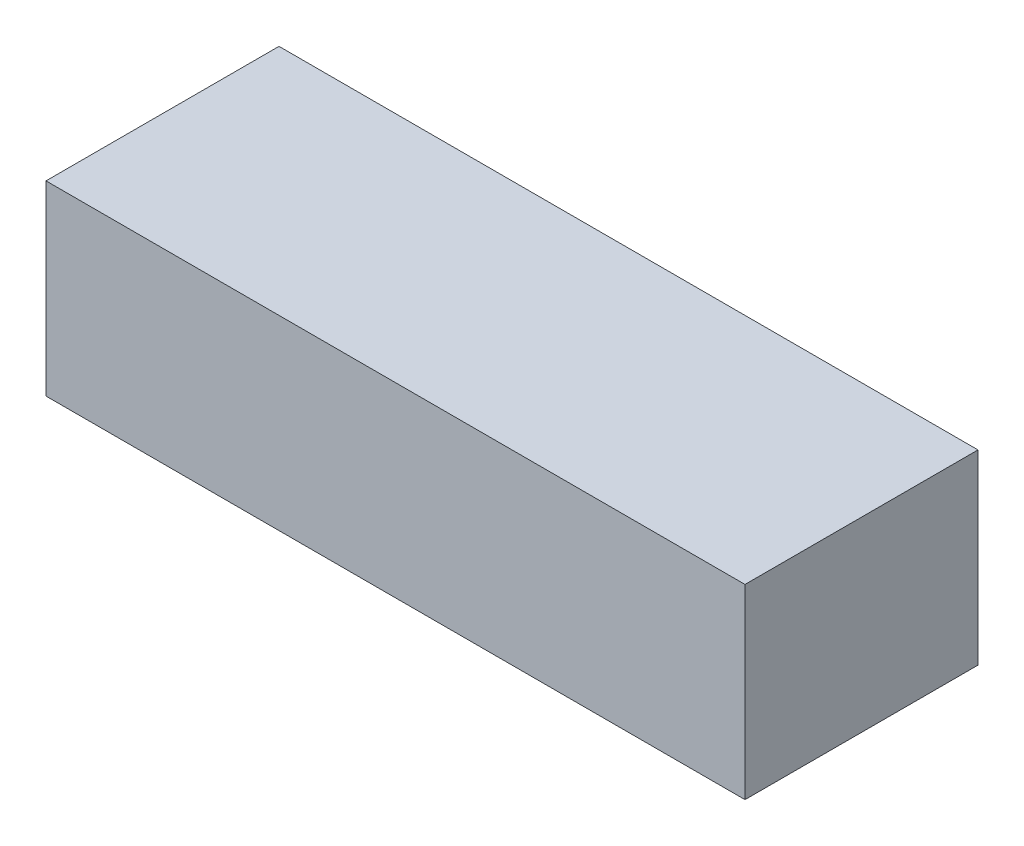
ISO-10303-21;
HEADER;
FILE_DESCRIPTION(('STEP AP214'),'2;1');
FILE_NAME('part.step','',(''),(''),'','','');
FILE_SCHEMA(('AUTOMOTIVE_DESIGN { 1 0 10303 214 1 1 1 1 }'));
ENDSEC;
DATA;
#1=APPLICATION_CONTEXT('core data for automotive mechanical design processes');
#2=APPLICATION_PROTOCOL_DEFINITION('international standard','automotive_design',2000,#1);
#3=PRODUCT_CONTEXT('',#1,'mechanical');
#4=PRODUCT('Part','Part','',(#3));
#5=PRODUCT_RELATED_PRODUCT_CATEGORY('part','',(#4));
#6=PRODUCT_DEFINITION_FORMATION('','',#4);
#7=PRODUCT_DEFINITION_CONTEXT('part definition',#1,'design');
#8=PRODUCT_DEFINITION('design','',#6,#7);
#9=PRODUCT_DEFINITION_SHAPE('','',#8);
#10=(LENGTH_UNIT() NAMED_UNIT(*) SI_UNIT(.MILLI.,.METRE.));
#11=(NAMED_UNIT(*) PLANE_ANGLE_UNIT() SI_UNIT($,.RADIAN.));
#12=(NAMED_UNIT(*) SI_UNIT($,.STERADIAN.) SOLID_ANGLE_UNIT());
#13=UNCERTAINTY_MEASURE_WITH_UNIT(LENGTH_MEASURE(1.E-05),#10,'distance_accuracy_value','');
#14=(GEOMETRIC_REPRESENTATION_CONTEXT(3) GLOBAL_UNCERTAINTY_ASSIGNED_CONTEXT((#13)) GLOBAL_UNIT_ASSIGNED_CONTEXT((#10,
#11,#12)) REPRESENTATION_CONTEXT('',''));
#15=CARTESIAN_POINT('',(0.,0.,0.));
#16=DIRECTION('',(0.,0.,1.));
#17=DIRECTION('',(1.,0.,0.));
#18=AXIS2_PLACEMENT_3D('',#15,#16,#17);
#19=CARTESIAN_POINT('',(1.51,-0.41,0.));
#20=DIRECTION('',(0.,0.,-1.));
#21=DIRECTION('',(-1.,0.,0.));
#22=AXIS2_PLACEMENT_3D('',#19,#20,#21);
#23=PLANE('',#22);
#24=DIRECTION('',(0.,-1.,0.));
#25=VECTOR('',#24,1.);
#26=CARTESIAN_POINT('',(-1.5,0.,0.));
#27=LINE('',#26,#25);
#28=CARTESIAN_POINT('',(-1.5,0.4,0.));
#29=VERTEX_POINT('',#28);
#30=CARTESIAN_POINT('',(-1.5,-0.4,0.));
#31=VERTEX_POINT('',#30);
#32=EDGE_CURVE('E68',#29,#31,#27,.T.);
#33=ORIENTED_EDGE('',*,*,#32,.F.);
#34=DIRECTION('',(-1.,0.,0.));
#35=VECTOR('',#34,1.);
#36=CARTESIAN_POINT('',(0.,0.4,0.));
#37=LINE('',#36,#35);
#38=CARTESIAN_POINT('',(1.5,0.4,0.));
#39=VERTEX_POINT('',#38);
#40=EDGE_CURVE('E55',#39,#29,#37,.T.);
#41=ORIENTED_EDGE('',*,*,#40,.F.);
#42=DIRECTION('',(0.,1.,0.));
#43=VECTOR('',#42,1.);
#44=CARTESIAN_POINT('',(1.5,0.,0.));
#45=LINE('',#44,#43);
#46=CARTESIAN_POINT('',(1.5,-0.4,0.));
#47=VERTEX_POINT('',#46);
#48=EDGE_CURVE('E20',#47,#39,#45,.T.);
#49=ORIENTED_EDGE('',*,*,#48,.F.);
#50=DIRECTION('',(1.,0.,0.));
#51=VECTOR('',#50,1.);
#52=CARTESIAN_POINT('',(0.,-0.4,0.));
#53=LINE('',#52,#51);
#54=EDGE_CURVE('E80',#31,#47,#53,.T.);
#55=ORIENTED_EDGE('',*,*,#54,.F.);
#56=EDGE_LOOP('',(#33,#41,#49,#55));
#57=FACE_BOUND('',#56,.T.);
#58=ADVANCED_FACE('F16',(#57),#23,.T.);
#59=CARTESIAN_POINT('',(1.5,-0.41,1.01));
#60=DIRECTION('',(1.,0.,0.));
#61=DIRECTION('',(0.,0.,-1.));
#62=AXIS2_PLACEMENT_3D('',#59,#60,#61);
#63=PLANE('',#62);
#64=DIRECTION('',(0.,0.,-1.));
#65=VECTOR('',#64,1.);
#66=CARTESIAN_POINT('',(1.5,0.4,0.5));
#67=LINE('',#66,#65);
#68=CARTESIAN_POINT('',(1.5,0.4,1.));
#69=VERTEX_POINT('',#68);
#70=EDGE_CURVE('E61',#69,#39,#67,.T.);
#71=ORIENTED_EDGE('',*,*,#70,.F.);
#72=DIRECTION('',(0.,1.,0.));
#73=VECTOR('',#72,1.);
#74=CARTESIAN_POINT('',(1.5,0.,1.));
#75=LINE('',#74,#73);
#76=CARTESIAN_POINT('',(1.5,-0.4,1.));
#77=VERTEX_POINT('',#76);
#78=EDGE_CURVE('E83',#77,#69,#75,.T.);
#79=ORIENTED_EDGE('',*,*,#78,.F.);
#80=DIRECTION('',(0.,0.,1.));
#81=VECTOR('',#80,1.);
#82=CARTESIAN_POINT('',(1.5,-0.4,0.5));
#83=LINE('',#82,#81);
#84=EDGE_CURVE('E64',#47,#77,#83,.T.);
#85=ORIENTED_EDGE('',*,*,#84,.F.);
#86=ORIENTED_EDGE('',*,*,#48,.T.);
#87=EDGE_LOOP('',(#71,#79,#85,#86));
#88=FACE_BOUND('',#87,.T.);
#89=ADVANCED_FACE('F60',(#88),#63,.T.);
#90=CARTESIAN_POINT('',(-1.51,0.4,-0.01));
#91=DIRECTION('',(0.,1.,0.));
#92=DIRECTION('',(0.,0.,1.));
#93=AXIS2_PLACEMENT_3D('',#90,#91,#92);
#94=PLANE('',#93);
#95=DIRECTION('',(0.,0.,-1.));
#96=VECTOR('',#95,1.);
#97=CARTESIAN_POINT('',(-1.5,0.4,0.5));
#98=LINE('',#97,#96);
#99=CARTESIAN_POINT('',(-1.5,0.4,1.));
#100=VERTEX_POINT('',#99);
#101=EDGE_CURVE('E70',#100,#29,#98,.T.);
#102=ORIENTED_EDGE('',*,*,#101,.F.);
#103=DIRECTION('',(-1.,0.,0.));
#104=VECTOR('',#103,1.);
#105=CARTESIAN_POINT('',(0.,0.4,1.));
#106=LINE('',#105,#104);
#107=EDGE_CURVE('E74',#69,#100,#106,.T.);
#108=ORIENTED_EDGE('',*,*,#107,.F.);
#109=ORIENTED_EDGE('',*,*,#70,.T.);
#110=ORIENTED_EDGE('',*,*,#40,.T.);
#111=EDGE_LOOP('',(#102,#108,#109,#110));
#112=FACE_BOUND('',#111,.T.);
#113=ADVANCED_FACE('F72',(#112),#94,.T.);
#114=CARTESIAN_POINT('',(-1.5,-0.41,-0.01));
#115=DIRECTION('',(-1.,0.,0.));
#116=DIRECTION('',(0.,0.,1.));
#117=AXIS2_PLACEMENT_3D('',#114,#115,#116);
#118=PLANE('',#117);
#119=DIRECTION('',(0.,0.,-1.));
#120=VECTOR('',#119,1.);
#121=CARTESIAN_POINT('',(-1.5,-0.4,0.5));
#122=LINE('',#121,#120);
#123=CARTESIAN_POINT('',(-1.5,-0.4,1.));
#124=VERTEX_POINT('',#123);
#125=EDGE_CURVE('E35',#124,#31,#122,.T.);
#126=ORIENTED_EDGE('',*,*,#125,.F.);
#127=DIRECTION('',(0.,-1.,0.));
#128=VECTOR('',#127,1.);
#129=CARTESIAN_POINT('',(-1.5,0.,1.));
#130=LINE('',#129,#128);
#131=EDGE_CURVE('E26',#100,#124,#130,.T.);
#132=ORIENTED_EDGE('',*,*,#131,.F.);
#133=ORIENTED_EDGE('',*,*,#101,.T.);
#134=ORIENTED_EDGE('',*,*,#32,.T.);
#135=EDGE_LOOP('',(#126,#132,#133,#134));
#136=FACE_BOUND('',#135,.T.);
#137=ADVANCED_FACE('F88',(#136),#118,.T.);
#138=CARTESIAN_POINT('',(-1.51,-0.4,1.01));
#139=DIRECTION('',(0.,-1.,0.));
#140=DIRECTION('',(0.,0.,-1.));
#141=AXIS2_PLACEMENT_3D('',#138,#139,#140);
#142=PLANE('',#141);
#143=ORIENTED_EDGE('',*,*,#84,.T.);
#144=DIRECTION('',(1.,0.,0.));
#145=VECTOR('',#144,1.);
#146=CARTESIAN_POINT('',(0.,-0.4,1.));
#147=LINE('',#146,#145);
#148=EDGE_CURVE('E11',#124,#77,#147,.T.);
#149=ORIENTED_EDGE('',*,*,#148,.F.);
#150=ORIENTED_EDGE('',*,*,#125,.T.);
#151=ORIENTED_EDGE('',*,*,#54,.T.);
#152=EDGE_LOOP('',(#143,#149,#150,#151));
#153=FACE_BOUND('',#152,.T.);
#154=ADVANCED_FACE('F90',(#153),#142,.T.);
#155=CARTESIAN_POINT('',(-1.51,-0.41,1.));
#156=DIRECTION('',(0.,0.,1.));
#157=DIRECTION('',(1.,0.,0.));
#158=AXIS2_PLACEMENT_3D('',#155,#156,#157);
#159=PLANE('',#158);
#160=ORIENTED_EDGE('',*,*,#131,.T.);
#161=ORIENTED_EDGE('',*,*,#148,.T.);
#162=ORIENTED_EDGE('',*,*,#78,.T.);
#163=ORIENTED_EDGE('',*,*,#107,.T.);
#164=EDGE_LOOP('',(#160,#161,#162,#163));
#165=FACE_BOUND('',#164,.T.);
#166=ADVANCED_FACE('F18',(#165),#159,.T.);
#167=CLOSED_SHELL('',(#58,#89,#113,#137,#154,#166));
#168=MANIFOLD_SOLID_BREP('B1',#167);
#169=ADVANCED_BREP_SHAPE_REPRESENTATION('',(#18,#168),#14);
#170=SHAPE_DEFINITION_REPRESENTATION(#9,#169);
ENDSEC;
END-ISO-10303-21;
